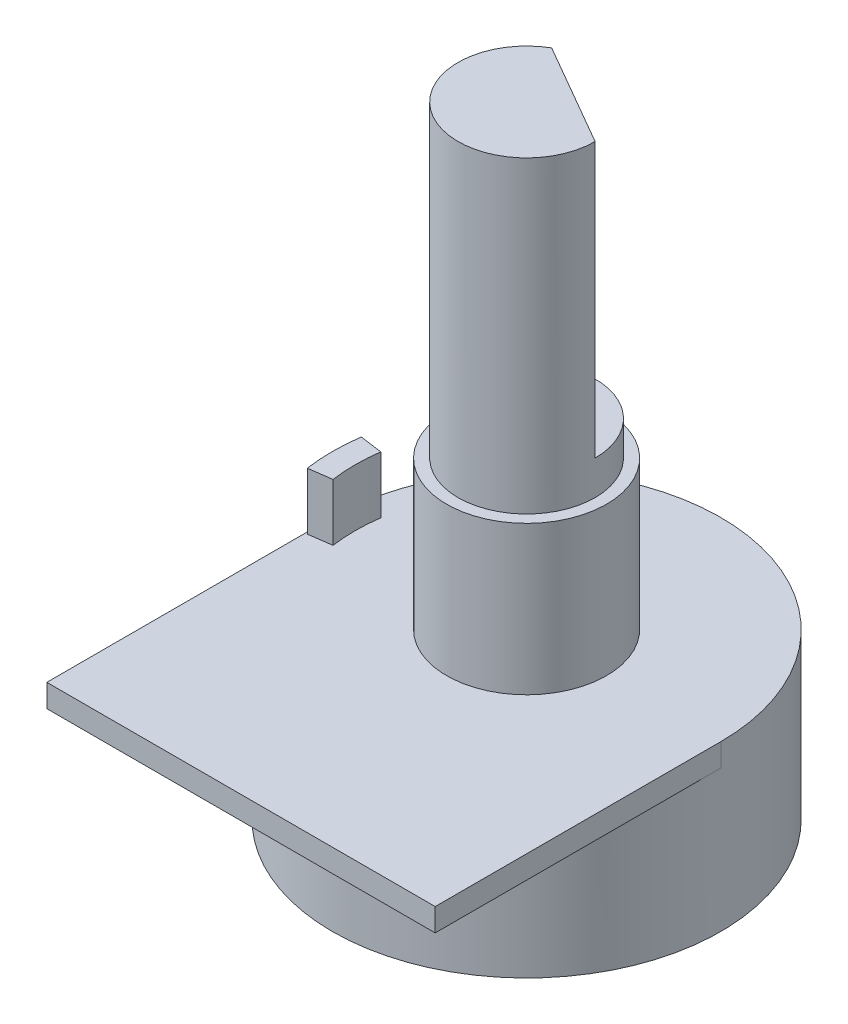
ISO-10303-21;
HEADER;
FILE_DESCRIPTION(('STEP AP214'),'2;1');
FILE_NAME('part.step','',(''),(''),'','','');
FILE_SCHEMA(('AUTOMOTIVE_DESIGN { 1 0 10303 214 1 1 1 1 }'));
ENDSEC;
DATA;
#1=APPLICATION_CONTEXT('core data for automotive mechanical design processes');
#2=APPLICATION_PROTOCOL_DEFINITION('international standard','automotive_design',2000,#1);
#3=PRODUCT_CONTEXT('',#1,'mechanical');
#4=PRODUCT('Part','Part','',(#3));
#5=PRODUCT_RELATED_PRODUCT_CATEGORY('part','',(#4));
#6=PRODUCT_DEFINITION_FORMATION('','',#4);
#7=PRODUCT_DEFINITION_CONTEXT('part definition',#1,'design');
#8=PRODUCT_DEFINITION('design','',#6,#7);
#9=PRODUCT_DEFINITION_SHAPE('','',#8);
#10=(LENGTH_UNIT() NAMED_UNIT(*) SI_UNIT(.MILLI.,.METRE.));
#11=(NAMED_UNIT(*) PLANE_ANGLE_UNIT() SI_UNIT($,.RADIAN.));
#12=(NAMED_UNIT(*) SI_UNIT($,.STERADIAN.) SOLID_ANGLE_UNIT());
#13=UNCERTAINTY_MEASURE_WITH_UNIT(LENGTH_MEASURE(1.E-05),#10,'distance_accuracy_value','');
#14=(GEOMETRIC_REPRESENTATION_CONTEXT(3) GLOBAL_UNCERTAINTY_ASSIGNED_CONTEXT((#13)) GLOBAL_UNIT_ASSIGNED_CONTEXT((#10,
#11,#12)) REPRESENTATION_CONTEXT('',''));
#15=CARTESIAN_POINT('',(0.,0.,0.));
#16=DIRECTION('',(0.,0.,1.));
#17=DIRECTION('',(1.,0.,0.));
#18=AXIS2_PLACEMENT_3D('',#15,#16,#17);
#19=CARTESIAN_POINT('',(0.,7.2,0.));
#20=DIRECTION('',(0.,-1.,0.));
#21=DIRECTION('',(0.,0.,-1.));
#22=AXIS2_PLACEMENT_3D('',#19,#20,#21);
#23=CYLINDRICAL_SURFACE('',#22,8.5);
#24=CARTESIAN_POINT('',(0.,7.2,0.));
#25=DIRECTION('',(0.,1.,0.));
#26=DIRECTION('',(0.,0.,1.));
#27=AXIS2_PLACEMENT_3D('',#24,#25,#26);
#28=CIRCLE('',#27,8.5);
#29=CARTESIAN_POINT('',(8.5,7.2,0.));
#30=VERTEX_POINT('',#29);
#31=CARTESIAN_POINT('',(-8.41727858430336,7.2,-1.1829713581605));
#32=VERTEX_POINT('',#31);
#33=EDGE_CURVE('E130',#30,#32,#28,.T.);
#34=ORIENTED_EDGE('',*,*,#33,.F.);
#35=DIRECTION('',(0.,1.,0.));
#36=VECTOR('',#35,1.);
#37=CARTESIAN_POINT('',(8.5,6.2,0.));
#38=LINE('',#37,#36);
#39=CARTESIAN_POINT('',(8.5,6.2,0.));
#40=VERTEX_POINT('',#39);
#41=EDGE_CURVE('E123',#40,#30,#38,.T.);
#42=ORIENTED_EDGE('',*,*,#41,.F.);
#43=CARTESIAN_POINT('',(0.,6.2,0.));
#44=DIRECTION('',(0.,-1.,0.));
#45=DIRECTION('',(0.,0.,-1.));
#46=AXIS2_PLACEMENT_3D('',#43,#44,#45);
#47=CIRCLE('',#46,8.5);
#48=CARTESIAN_POINT('',(-8.5,6.2,0.));
#49=VERTEX_POINT('',#48);
#50=EDGE_CURVE('E11',#40,#49,#47,.T.);
#51=ORIENTED_EDGE('',*,*,#50,.T.);
#52=DIRECTION('',(0.,1.,0.));
#53=VECTOR('',#52,1.);
#54=CARTESIAN_POINT('',(-8.5,6.2,0.));
#55=LINE('',#54,#53);
#56=CARTESIAN_POINT('',(-8.5,7.2,0.));
#57=VERTEX_POINT('',#56);
#58=EDGE_CURVE('E131',#49,#57,#55,.T.);
#59=ORIENTED_EDGE('',*,*,#58,.T.);
#60=CARTESIAN_POINT('',(0.,7.2,0.));
#61=DIRECTION('',(0.,-1.,0.));
#62=DIRECTION('',(0.,0.,-1.));
#63=AXIS2_PLACEMENT_3D('',#60,#61,#62);
#64=CIRCLE('',#63,8.5);
#65=CARTESIAN_POINT('',(-8.41727858430336,7.2,1.1829713581605));
#66=VERTEX_POINT('',#65);
#67=EDGE_CURVE('E139',#66,#57,#64,.T.);
#68=ORIENTED_EDGE('',*,*,#67,.F.);
#69=DIRECTION('',(0.,-1.,0.));
#70=VECTOR('',#69,1.);
#71=CARTESIAN_POINT('',(-8.41727858430336,9.7,1.1829713581605));
#72=LINE('',#71,#70);
#73=CARTESIAN_POINT('',(-8.41727858430336,9.7,1.1829713581605));
#74=VERTEX_POINT('',#73);
#75=EDGE_CURVE('E183',#74,#66,#72,.T.);
#76=ORIENTED_EDGE('',*,*,#75,.F.);
#77=CARTESIAN_POINT('',(0.,9.7,0.));
#78=DIRECTION('',(0.,1.,0.));
#79=DIRECTION('',(0.,0.,1.));
#80=AXIS2_PLACEMENT_3D('',#77,#78,#79);
#81=CIRCLE('',#80,8.5);
#82=CARTESIAN_POINT('',(-8.41727858430336,9.7,-1.1829713581605));
#83=VERTEX_POINT('',#82);
#84=EDGE_CURVE('E170',#83,#74,#81,.T.);
#85=ORIENTED_EDGE('',*,*,#84,.F.);
#86=DIRECTION('',(0.,-1.,0.));
#87=VECTOR('',#86,1.);
#88=CARTESIAN_POINT('',(-8.41727858430336,9.7,-1.1829713581605));
#89=LINE('',#88,#87);
#90=EDGE_CURVE('E186',#83,#32,#89,.T.);
#91=ORIENTED_EDGE('',*,*,#90,.T.);
#92=EDGE_LOOP('',(#34,#42,#51,#59,#68,#76,#85,#91));
#93=FACE_BOUND('',#92,.T.);
#94=CARTESIAN_POINT('',(0.,0.,0.));
#95=DIRECTION('',(0.,1.,0.));
#96=DIRECTION('',(0.,0.,1.));
#97=AXIS2_PLACEMENT_3D('',#94,#95,#96);
#98=CIRCLE('',#97,8.5);
#99=CARTESIAN_POINT('',(0.,0.,8.5));
#100=VERTEX_POINT('',#99);
#101=EDGE_CURVE('E191',#100,#100,#98,.T.);
#102=ORIENTED_EDGE('',*,*,#101,.T.);
#103=EDGE_LOOP('',(#102));
#104=FACE_BOUND('',#103,.T.);
#105=ADVANCED_FACE('F33',(#93,#104),#23,.T.);
#106=CARTESIAN_POINT('',(0.,7.2,0.));
#107=DIRECTION('',(0.,1.,0.));
#108=DIRECTION('',(0.,0.,1.));
#109=AXIS2_PLACEMENT_3D('',#106,#107,#108);
#110=PLANE('',#109);
#111=CARTESIAN_POINT('',(0.,7.2,0.));
#112=DIRECTION('',(0.,1.,0.));
#113=DIRECTION('',(0.,0.,1.));
#114=AXIS2_PLACEMENT_3D('',#111,#112,#113);
#115=CIRCLE('',#114,3.5);
#116=CARTESIAN_POINT('',(0.,7.2,-3.5));
#117=VERTEX_POINT('',#116);
#118=EDGE_CURVE('E155',#117,#117,#115,.T.);
#119=ORIENTED_EDGE('',*,*,#118,.F.);
#120=EDGE_LOOP('',(#119));
#121=FACE_BOUND('',#120,.T.);
#122=DIRECTION('',(0.990268068741571,0.,-0.139173100960059));
#123=VECTOR('',#122,1.);
#124=CARTESIAN_POINT('',(-7.42701051556178,7.2,1.04379825720044));
#125=LINE('',#124,#123);
#126=CARTESIAN_POINT('',(-7.42701051556178,7.2,1.04379825720044));
#127=VERTEX_POINT('',#126);
#128=EDGE_CURVE('E168',#66,#127,#125,.T.);
#129=ORIENTED_EDGE('',*,*,#128,.F.);
#130=ORIENTED_EDGE('',*,*,#67,.T.);
#131=DIRECTION('',(0.,0.,1.));
#132=VECTOR('',#131,1.);
#133=CARTESIAN_POINT('',(-8.5,7.2,0.));
#134=LINE('',#133,#132);
#135=CARTESIAN_POINT('',(-8.5,7.2,12.5));
#136=VERTEX_POINT('',#135);
#137=EDGE_CURVE('E326',#57,#136,#134,.T.);
#138=ORIENTED_EDGE('',*,*,#137,.T.);
#139=DIRECTION('',(1.,0.,0.));
#140=VECTOR('',#139,1.);
#141=CARTESIAN_POINT('',(8.5,7.2,12.5));
#142=LINE('',#141,#140);
#143=CARTESIAN_POINT('',(8.5,7.2,12.5));
#144=VERTEX_POINT('',#143);
#145=EDGE_CURVE('E126',#136,#144,#142,.T.);
#146=ORIENTED_EDGE('',*,*,#145,.T.);
#147=DIRECTION('',(0.,0.,-1.));
#148=VECTOR('',#147,1.);
#149=CARTESIAN_POINT('',(8.5,7.2,0.));
#150=LINE('',#149,#148);
#151=EDGE_CURVE('E47',#144,#30,#150,.T.);
#152=ORIENTED_EDGE('',*,*,#151,.T.);
#153=ORIENTED_EDGE('',*,*,#33,.T.);
#154=DIRECTION('',(-0.990268068741571,0.,-0.139173100960058));
#155=VECTOR('',#154,1.);
#156=CARTESIAN_POINT('',(-7.42701051556178,7.2,-1.04379825720044));
#157=LINE('',#156,#155);
#158=CARTESIAN_POINT('',(-7.42701051556178,7.2,-1.04379825720044));
#159=VERTEX_POINT('',#158);
#160=EDGE_CURVE('E176',#159,#32,#157,.T.);
#161=ORIENTED_EDGE('',*,*,#160,.F.);
#162=CARTESIAN_POINT('',(0.,7.2,0.));
#163=DIRECTION('',(0.,-1.,0.));
#164=DIRECTION('',(0.,0.,1.));
#165=AXIS2_PLACEMENT_3D('',#162,#163,#164);
#166=CIRCLE('',#165,7.5);
#167=EDGE_CURVE('E161',#127,#159,#166,.T.);
#168=ORIENTED_EDGE('',*,*,#167,.F.);
#169=EDGE_LOOP('',(#129,#130,#138,#146,#152,#153,#161,#168));
#170=FACE_BOUND('',#169,.T.);
#171=ADVANCED_FACE('F198',(#121,#170),#110,.T.);
#172=CARTESIAN_POINT('',(0.,0.,0.));
#173=DIRECTION('',(0.,1.,0.));
#174=DIRECTION('',(0.,0.,1.));
#175=AXIS2_PLACEMENT_3D('',#172,#173,#174);
#176=PLANE('',#175);
#177=ORIENTED_EDGE('',*,*,#101,.F.);
#178=EDGE_LOOP('',(#177));
#179=FACE_BOUND('',#178,.T.);
#180=ADVANCED_FACE('F195',(#179),#176,.F.);
#181=CARTESIAN_POINT('',(0.,9.7,0.));
#182=DIRECTION('',(0.,-1.,0.));
#183=DIRECTION('',(0.,0.,-1.));
#184=AXIS2_PLACEMENT_3D('',#181,#182,#183);
#185=CYLINDRICAL_SURFACE('',#184,7.5);
#186=ORIENTED_EDGE('',*,*,#167,.T.);
#187=DIRECTION('',(0.,-1.,0.));
#188=VECTOR('',#187,1.);
#189=CARTESIAN_POINT('',(-7.42701051556178,9.7,-1.04379825720044));
#190=LINE('',#189,#188);
#191=CARTESIAN_POINT('',(-7.42701051556178,9.7,-1.04379825720044));
#192=VERTEX_POINT('',#191);
#193=EDGE_CURVE('E188',#192,#159,#190,.T.);
#194=ORIENTED_EDGE('',*,*,#193,.F.);
#195=CARTESIAN_POINT('',(0.,9.7,0.));
#196=DIRECTION('',(0.,-1.,0.));
#197=DIRECTION('',(0.,0.,1.));
#198=AXIS2_PLACEMENT_3D('',#195,#196,#197);
#199=CIRCLE('',#198,7.5);
#200=CARTESIAN_POINT('',(-7.42701051556178,9.7,1.04379825720044));
#201=VERTEX_POINT('',#200);
#202=EDGE_CURVE('E164',#201,#192,#199,.T.);
#203=ORIENTED_EDGE('',*,*,#202,.F.);
#204=DIRECTION('',(0.,-1.,0.));
#205=VECTOR('',#204,1.);
#206=CARTESIAN_POINT('',(-7.42701051556178,9.7,1.04379825720044));
#207=LINE('',#206,#205);
#208=EDGE_CURVE('E174',#201,#127,#207,.T.);
#209=ORIENTED_EDGE('',*,*,#208,.T.);
#210=EDGE_LOOP('',(#186,#194,#203,#209));
#211=FACE_BOUND('',#210,.T.);
#212=ADVANCED_FACE('F197',(#211),#185,.F.);
#213=CARTESIAN_POINT('',(-7.42701051556178,9.7,-1.04379825720044));
#214=DIRECTION('',(-0.139173100960058,0.,0.990268068741571));
#215=DIRECTION('',(0.990268068741571,0.,0.139173100960058));
#216=AXIS2_PLACEMENT_3D('',#213,#214,#215);
#217=PLANE('',#216);
#218=ORIENTED_EDGE('',*,*,#160,.T.);
#219=ORIENTED_EDGE('',*,*,#90,.F.);
#220=DIRECTION('',(-0.990268068741571,0.,-0.139173100960058));
#221=VECTOR('',#220,1.);
#222=CARTESIAN_POINT('',(-7.42701051556178,9.7,-1.04379825720044));
#223=LINE('',#222,#221);
#224=EDGE_CURVE('E167',#192,#83,#223,.T.);
#225=ORIENTED_EDGE('',*,*,#224,.F.);
#226=ORIENTED_EDGE('',*,*,#193,.T.);
#227=EDGE_LOOP('',(#218,#219,#225,#226));
#228=FACE_BOUND('',#227,.T.);
#229=ADVANCED_FACE('F203',(#228),#217,.F.);
#230=CARTESIAN_POINT('',(-7.42701051556178,9.7,1.04379825720044));
#231=DIRECTION('',(-0.139173100960059,0.,-0.990268068741571));
#232=DIRECTION('',(-0.990268068741571,0.,0.139173100960059));
#233=AXIS2_PLACEMENT_3D('',#230,#231,#232);
#234=PLANE('',#233);
#235=ORIENTED_EDGE('',*,*,#128,.T.);
#236=ORIENTED_EDGE('',*,*,#208,.F.);
#237=DIRECTION('',(0.990268068741571,0.,-0.139173100960059));
#238=VECTOR('',#237,1.);
#239=CARTESIAN_POINT('',(-7.42701051556178,9.7,1.04379825720044));
#240=LINE('',#239,#238);
#241=EDGE_CURVE('E172',#74,#201,#240,.T.);
#242=ORIENTED_EDGE('',*,*,#241,.F.);
#243=ORIENTED_EDGE('',*,*,#75,.T.);
#244=EDGE_LOOP('',(#235,#236,#242,#243));
#245=FACE_BOUND('',#244,.T.);
#246=ADVANCED_FACE('F232',(#245),#234,.F.);
#247=CARTESIAN_POINT('',(0.,9.7,0.));
#248=DIRECTION('',(0.,1.,0.));
#249=DIRECTION('',(0.,0.,1.));
#250=AXIS2_PLACEMENT_3D('',#247,#248,#249);
#251=PLANE('',#250);
#252=ORIENTED_EDGE('',*,*,#202,.T.);
#253=ORIENTED_EDGE('',*,*,#224,.T.);
#254=ORIENTED_EDGE('',*,*,#84,.T.);
#255=ORIENTED_EDGE('',*,*,#241,.T.);
#256=EDGE_LOOP('',(#252,#253,#254,#255));
#257=FACE_BOUND('',#256,.T.);
#258=ADVANCED_FACE('F237',(#257),#251,.T.);
#259=CARTESIAN_POINT('',(0.,13.7,0.));
#260=DIRECTION('',(0.,-1.,0.));
#261=DIRECTION('',(0.,0.,-1.));
#262=AXIS2_PLACEMENT_3D('',#259,#260,#261);
#263=CYLINDRICAL_SURFACE('',#262,3.5);
#264=CARTESIAN_POINT('',(0.,13.7,0.));
#265=DIRECTION('',(0.,1.,0.));
#266=DIRECTION('',(0.,0.,1.));
#267=AXIS2_PLACEMENT_3D('',#264,#265,#266);
#268=CIRCLE('',#267,3.5);
#269=CARTESIAN_POINT('',(0.,13.7,-3.5));
#270=VERTEX_POINT('',#269);
#271=EDGE_CURVE('E158',#270,#270,#268,.T.);
#272=CARTESIAN_POINT('',(0.,13.7,-3.5));
#273=CARTESIAN_POINT('',(0.,13.6322916666667,-3.5));
#274=CARTESIAN_POINT('',(0.,13.5645833333333,-3.5));
#275=CARTESIAN_POINT('',(0.,13.4291666666667,-3.5));
#276=CARTESIAN_POINT('',(0.,13.3614583333333,-3.5));
#277=CARTESIAN_POINT('',(0.,13.2260416666667,-3.5));
#278=CARTESIAN_POINT('',(0.,13.1583333333333,-3.5));
#279=CARTESIAN_POINT('',(0.,13.0229166666667,-3.5));
#280=CARTESIAN_POINT('',(0.,12.9552083333333,-3.5));
#281=CARTESIAN_POINT('',(0.,12.8197916666667,-3.5));
#282=CARTESIAN_POINT('',(0.,12.7520833333333,-3.5));
#283=CARTESIAN_POINT('',(0.,12.6166666666667,-3.5));
#284=CARTESIAN_POINT('',(0.,12.5489583333333,-3.5));
#285=CARTESIAN_POINT('',(0.,12.4135416666667,-3.5));
#286=CARTESIAN_POINT('',(0.,12.3458333333333,-3.5));
#287=CARTESIAN_POINT('',(0.,12.2104166666667,-3.5));
#288=CARTESIAN_POINT('',(0.,12.1427083333333,-3.5));
#289=CARTESIAN_POINT('',(0.,12.0072916666667,-3.5));
#290=CARTESIAN_POINT('',(0.,11.9395833333333,-3.5));
#291=CARTESIAN_POINT('',(0.,11.8041666666667,-3.5));
#292=CARTESIAN_POINT('',(0.,11.7364583333333,-3.5));
#293=CARTESIAN_POINT('',(0.,11.6010416666667,-3.5));
#294=CARTESIAN_POINT('',(0.,11.5333333333333,-3.5));
#295=CARTESIAN_POINT('',(0.,11.3979166666667,-3.5));
#296=CARTESIAN_POINT('',(0.,11.3302083333333,-3.5));
#297=CARTESIAN_POINT('',(0.,11.1947916666667,-3.5));
#298=CARTESIAN_POINT('',(0.,11.1270833333333,-3.5));
#299=CARTESIAN_POINT('',(0.,10.9916666666667,-3.5));
#300=CARTESIAN_POINT('',(0.,10.9239583333333,-3.5));
#301=CARTESIAN_POINT('',(0.,10.7885416666667,-3.5));
#302=CARTESIAN_POINT('',(0.,10.7208333333333,-3.5));
#303=CARTESIAN_POINT('',(0.,10.5854166666667,-3.5));
#304=CARTESIAN_POINT('',(0.,10.5177083333333,-3.5));
#305=CARTESIAN_POINT('',(0.,10.3822916666667,-3.5));
#306=CARTESIAN_POINT('',(0.,10.3145833333333,-3.5));
#307=CARTESIAN_POINT('',(0.,10.1791666666667,-3.5));
#308=CARTESIAN_POINT('',(0.,10.1114583333333,-3.5));
#309=CARTESIAN_POINT('',(0.,9.97604166666667,-3.5));
#310=CARTESIAN_POINT('',(0.,9.90833333333333,-3.5));
#311=CARTESIAN_POINT('',(0.,9.77291666666667,-3.5));
#312=CARTESIAN_POINT('',(0.,9.70520833333333,-3.5));
#313=CARTESIAN_POINT('',(0.,9.56979166666667,-3.5));
#314=CARTESIAN_POINT('',(0.,9.50208333333333,-3.5));
#315=CARTESIAN_POINT('',(0.,9.36666666666667,-3.5));
#316=CARTESIAN_POINT('',(0.,9.29895833333333,-3.5));
#317=CARTESIAN_POINT('',(0.,9.16354166666667,-3.5));
#318=CARTESIAN_POINT('',(0.,9.09583333333333,-3.5));
#319=CARTESIAN_POINT('',(0.,8.96041666666667,-3.5));
#320=CARTESIAN_POINT('',(0.,8.89270833333333,-3.5));
#321=CARTESIAN_POINT('',(0.,8.75729166666667,-3.5));
#322=CARTESIAN_POINT('',(0.,8.68958333333333,-3.5));
#323=CARTESIAN_POINT('',(0.,8.55416666666667,-3.5));
#324=CARTESIAN_POINT('',(0.,8.48645833333333,-3.5));
#325=CARTESIAN_POINT('',(0.,8.35104166666667,-3.5));
#326=CARTESIAN_POINT('',(0.,8.28333333333333,-3.5));
#327=CARTESIAN_POINT('',(0.,8.14791666666667,-3.5));
#328=CARTESIAN_POINT('',(0.,8.08020833333333,-3.5));
#329=CARTESIAN_POINT('',(0.,7.94479166666667,-3.5));
#330=CARTESIAN_POINT('',(0.,7.87708333333333,-3.5));
#331=CARTESIAN_POINT('',(0.,7.74166666666667,-3.5));
#332=CARTESIAN_POINT('',(0.,7.67395833333333,-3.5));
#333=CARTESIAN_POINT('',(0.,7.53854166666667,-3.5));
#334=CARTESIAN_POINT('',(0.,7.47083333333333,-3.5));
#335=CARTESIAN_POINT('',(0.,7.33541666666667,-3.5));
#336=CARTESIAN_POINT('',(0.,7.26770833333333,-3.5));
#337=CARTESIAN_POINT('',(0.,7.2,-3.5));
#338=B_SPLINE_CURVE_WITH_KNOTS('',3,(#272,#273,#274,#275,#276,#277,#278,#279,#280,#281,#282,
#283,#284,#285,#286,#287,#288,#289,#290,#291,#292,#293,#294,#295,#296,#297,#298,#299,#300,#301,
#302,#303,#304,#305,#306,#307,#308,#309,#310,#311,#312,#313,#314,#315,#316,#317,#318,#319,#320,
#321,#322,#323,#324,#325,#326,#327,#328,#329,#330,#331,#332,#333,#334,#335,#336,#337),
.UNSPECIFIED.,.F.,.F.,(4,2,2,2,2,2,2,2,2,2,2,2,2,2,2,2,2,2,2,2,2,2,2,2,2,2,2,2,2,2,2,2,4),(0.,
0.203125,0.40625,0.609375000000001,0.812500000000001,1.015625,1.21875,1.421875,1.625,1.828125,
2.03125,2.234375,2.4375,2.640625,2.84375,3.046875,3.25,3.453125,3.65625,3.859375,4.0625,
4.265625,4.46875,4.671875,4.875,5.078125,5.28125,5.484375,5.6875,5.890625,6.09375,6.296875,6.5),.UNSPECIFIED.);
#339=EDGE_CURVE('BSEAM245',#270,#117,#338,.T.);
#340=ORIENTED_EDGE('',*,*,#271,.F.);
#341=ORIENTED_EDGE('',*,*,#118,.T.);
#342=ORIENTED_EDGE('',*,*,#339,.T.);
#343=ORIENTED_EDGE('',*,*,#339,.F.);
#344=EDGE_LOOP('',(#340,#342,#341,#343));
#345=FACE_BOUND('',#344,.T.);
#346=ADVANCED_FACE('F245',(#345),#263,.T.);
#347=CARTESIAN_POINT('',(0.,13.7,0.));
#348=DIRECTION('',(0.,1.,0.));
#349=DIRECTION('',(0.,0.,1.));
#350=AXIS2_PLACEMENT_3D('',#347,#348,#349);
#351=PLANE('',#350);
#352=CARTESIAN_POINT('',(0.,13.7,0.));
#353=DIRECTION('',(0.,1.,0.));
#354=DIRECTION('',(0.,0.,1.));
#355=AXIS2_PLACEMENT_3D('',#352,#353,#354);
#356=CIRCLE('',#355,3.);
#357=CARTESIAN_POINT('',(0.,13.7,3.));
#358=VERTEX_POINT('',#357);
#359=EDGE_CURVE('E40',#358,#358,#356,.T.);
#360=ORIENTED_EDGE('',*,*,#359,.F.);
#361=EDGE_LOOP('',(#360));
#362=FACE_BOUND('',#361,.T.);
#363=ORIENTED_EDGE('',*,*,#271,.T.);
#364=EDGE_LOOP('',(#363));
#365=FACE_BOUND('',#364,.T.);
#366=ADVANCED_FACE('F250',(#362,#365),#351,.T.);
#367=CARTESIAN_POINT('',(0.,27.2,0.));
#368=DIRECTION('',(0.,-1.,0.));
#369=DIRECTION('',(0.,0.,-1.));
#370=AXIS2_PLACEMENT_3D('',#367,#368,#369);
#371=CYLINDRICAL_SURFACE('',#370,3.);
#372=CARTESIAN_POINT('',(0.,27.2,0.));
#373=DIRECTION('',(0.,1.,0.));
#374=DIRECTION('',(0.,0.,1.));
#375=AXIS2_PLACEMENT_3D('',#372,#373,#374);
#376=CIRCLE('',#375,3.);
#377=CARTESIAN_POINT('',(-1.50000000000001,27.2,-2.59807621135331));
#378=VERTEX_POINT('',#377);
#379=CARTESIAN_POINT('',(3.,27.2,0.));
#380=VERTEX_POINT('',#379);
#381=EDGE_CURVE('E151',#378,#380,#376,.T.);
#382=ORIENTED_EDGE('',*,*,#381,.F.);
#383=DIRECTION('',(0.,1.,0.));
#384=VECTOR('',#383,1.);
#385=CARTESIAN_POINT('',(-1.50000000000001,15.2,-2.59807621135331));
#386=LINE('',#385,#384);
#387=CARTESIAN_POINT('',(-1.50000000000001,15.2,-2.59807621135331));
#388=VERTEX_POINT('',#387);
#389=EDGE_CURVE('E55',#388,#378,#386,.T.);
#390=ORIENTED_EDGE('',*,*,#389,.F.);
#391=CARTESIAN_POINT('',(0.,15.2,0.));
#392=DIRECTION('',(0.,1.,0.));
#393=DIRECTION('',(0.,0.,1.));
#394=AXIS2_PLACEMENT_3D('',#391,#392,#393);
#395=CIRCLE('',#394,3.);
#396=CARTESIAN_POINT('',(3.,15.2,0.));
#397=VERTEX_POINT('',#396);
#398=EDGE_CURVE('E142',#397,#388,#395,.T.);
#399=ORIENTED_EDGE('',*,*,#398,.F.);
#400=DIRECTION('',(0.,1.,0.));
#401=VECTOR('',#400,1.);
#402=CARTESIAN_POINT('',(3.,15.2,0.));
#403=LINE('',#402,#401);
#404=EDGE_CURVE('E148',#397,#380,#403,.T.);
#405=ORIENTED_EDGE('',*,*,#404,.T.);
#406=EDGE_LOOP('',(#382,#390,#399,#405));
#407=FACE_BOUND('',#406,.T.);
#408=ORIENTED_EDGE('',*,*,#359,.T.);
#409=EDGE_LOOP('',(#408));
#410=FACE_BOUND('',#409,.T.);
#411=ADVANCED_FACE('F303',(#407,#410),#371,.T.);
#412=CARTESIAN_POINT('',(0.,27.2,0.));
#413=DIRECTION('',(0.,1.,0.));
#414=DIRECTION('',(0.,0.,1.));
#415=AXIS2_PLACEMENT_3D('',#412,#413,#414);
#416=PLANE('',#415);
#417=DIRECTION('',(0.86602540378444,0.,0.499999999999998));
#418=VECTOR('',#417,1.);
#419=CARTESIAN_POINT('',(-1.50000000000001,27.2,-2.59807621135331));
#420=LINE('',#419,#418);
#421=EDGE_CURVE('E141',#378,#380,#420,.T.);
#422=ORIENTED_EDGE('',*,*,#421,.F.);
#423=ORIENTED_EDGE('',*,*,#381,.T.);
#424=EDGE_LOOP('',(#422,#423));
#425=FACE_BOUND('',#424,.T.);
#426=ADVANCED_FACE('F300',(#425),#416,.T.);
#427=CARTESIAN_POINT('',(-1.50000000000001,15.2,-2.59807621135331));
#428=DIRECTION('',(-0.499999999999998,0.,0.86602540378444));
#429=DIRECTION('',(0.86602540378444,0.,0.499999999999998));
#430=AXIS2_PLACEMENT_3D('',#427,#428,#429);
#431=PLANE('',#430);
#432=ORIENTED_EDGE('',*,*,#421,.T.);
#433=ORIENTED_EDGE('',*,*,#404,.F.);
#434=DIRECTION('',(0.86602540378444,0.,0.499999999999998));
#435=VECTOR('',#434,1.);
#436=CARTESIAN_POINT('',(-1.50000000000001,15.2,-2.59807621135331));
#437=LINE('',#436,#435);
#438=EDGE_CURVE('E144',#388,#397,#437,.T.);
#439=ORIENTED_EDGE('',*,*,#438,.F.);
#440=ORIENTED_EDGE('',*,*,#389,.T.);
#441=EDGE_LOOP('',(#432,#433,#439,#440));
#442=FACE_BOUND('',#441,.T.);
#443=ADVANCED_FACE('F296',(#442),#431,.F.);
#444=CARTESIAN_POINT('',(0.,15.2,0.));
#445=DIRECTION('',(0.,1.,0.));
#446=DIRECTION('',(0.,0.,1.));
#447=AXIS2_PLACEMENT_3D('',#444,#445,#446);
#448=PLANE('',#447);
#449=ORIENTED_EDGE('',*,*,#398,.T.);
#450=ORIENTED_EDGE('',*,*,#438,.T.);
#451=EDGE_LOOP('',(#449,#450));
#452=FACE_BOUND('',#451,.T.);
#453=ADVANCED_FACE('F262',(#452),#448,.T.);
#454=CARTESIAN_POINT('',(8.5,6.2,0.));
#455=DIRECTION('',(1.,0.,0.));
#456=DIRECTION('',(0.,0.,-1.));
#457=AXIS2_PLACEMENT_3D('',#454,#455,#456);
#458=PLANE('',#457);
#459=ORIENTED_EDGE('',*,*,#151,.F.);
#460=DIRECTION('',(0.,1.,0.));
#461=VECTOR('',#460,1.);
#462=CARTESIAN_POINT('',(8.5,6.2,12.5));
#463=LINE('',#462,#461);
#464=CARTESIAN_POINT('',(8.5,6.2,12.5));
#465=VERTEX_POINT('',#464);
#466=EDGE_CURVE('E125',#465,#144,#463,.T.);
#467=ORIENTED_EDGE('',*,*,#466,.F.);
#468=DIRECTION('',(0.,0.,-1.));
#469=VECTOR('',#468,1.);
#470=CARTESIAN_POINT('',(8.5,6.2,0.));
#471=LINE('',#470,#469);
#472=EDGE_CURVE('E114',#465,#40,#471,.T.);
#473=ORIENTED_EDGE('',*,*,#472,.T.);
#474=ORIENTED_EDGE('',*,*,#41,.T.);
#475=EDGE_LOOP('',(#459,#467,#473,#474));
#476=FACE_BOUND('',#475,.T.);
#477=ADVANCED_FACE('F122',(#476),#458,.T.);
#478=CARTESIAN_POINT('',(8.5,6.2,12.5));
#479=DIRECTION('',(0.,0.,1.));
#480=DIRECTION('',(1.,0.,0.));
#481=AXIS2_PLACEMENT_3D('',#478,#479,#480);
#482=PLANE('',#481);
#483=ORIENTED_EDGE('',*,*,#145,.F.);
#484=DIRECTION('',(0.,1.,0.));
#485=VECTOR('',#484,1.);
#486=CARTESIAN_POINT('',(-8.5,6.2,12.5));
#487=LINE('',#486,#485);
#488=CARTESIAN_POINT('',(-8.5,6.2,12.5));
#489=VERTEX_POINT('',#488);
#490=EDGE_CURVE('E134',#489,#136,#487,.T.);
#491=ORIENTED_EDGE('',*,*,#490,.F.);
#492=DIRECTION('',(1.,0.,0.));
#493=VECTOR('',#492,1.);
#494=CARTESIAN_POINT('',(8.5,6.2,12.5));
#495=LINE('',#494,#493);
#496=EDGE_CURVE('E132',#489,#465,#495,.T.);
#497=ORIENTED_EDGE('',*,*,#496,.T.);
#498=ORIENTED_EDGE('',*,*,#466,.T.);
#499=EDGE_LOOP('',(#483,#491,#497,#498));
#500=FACE_BOUND('',#499,.T.);
#501=ADVANCED_FACE('F261',(#500),#482,.T.);
#502=CARTESIAN_POINT('',(-8.5,6.2,0.));
#503=DIRECTION('',(-1.,0.,0.));
#504=DIRECTION('',(0.,0.,1.));
#505=AXIS2_PLACEMENT_3D('',#502,#503,#504);
#506=PLANE('',#505);
#507=ORIENTED_EDGE('',*,*,#137,.F.);
#508=ORIENTED_EDGE('',*,*,#58,.F.);
#509=DIRECTION('',(0.,0.,1.));
#510=VECTOR('',#509,1.);
#511=CARTESIAN_POINT('',(-8.5,6.2,0.));
#512=LINE('',#511,#510);
#513=EDGE_CURVE('E117',#49,#489,#512,.T.);
#514=ORIENTED_EDGE('',*,*,#513,.T.);
#515=ORIENTED_EDGE('',*,*,#490,.T.);
#516=EDGE_LOOP('',(#507,#508,#514,#515));
#517=FACE_BOUND('',#516,.T.);
#518=ADVANCED_FACE('F272',(#517),#506,.T.);
#519=CARTESIAN_POINT('',(0.,6.2,0.));
#520=DIRECTION('',(0.,-1.,0.));
#521=DIRECTION('',(0.,0.,-1.));
#522=AXIS2_PLACEMENT_3D('',#519,#520,#521);
#523=PLANE('',#522);
#524=ORIENTED_EDGE('',*,*,#50,.F.);
#525=ORIENTED_EDGE('',*,*,#472,.F.);
#526=ORIENTED_EDGE('',*,*,#496,.F.);
#527=ORIENTED_EDGE('',*,*,#513,.F.);
#528=EDGE_LOOP('',(#524,#525,#526,#527));
#529=FACE_BOUND('',#528,.T.);
#530=ADVANCED_FACE('F112',(#529),#523,.T.);
#531=CLOSED_SHELL('',(#105,#171,#180,#212,#229,#246,#258,#346,#366,#411,#426,#443,#453,#477,
#501,#518,#530));
#532=MANIFOLD_SOLID_BREP('B2',#531);
#533=ADVANCED_BREP_SHAPE_REPRESENTATION('',(#18,#532),#14);
#534=SHAPE_DEFINITION_REPRESENTATION(#9,#533);
ENDSEC;
END-ISO-10303-21;
